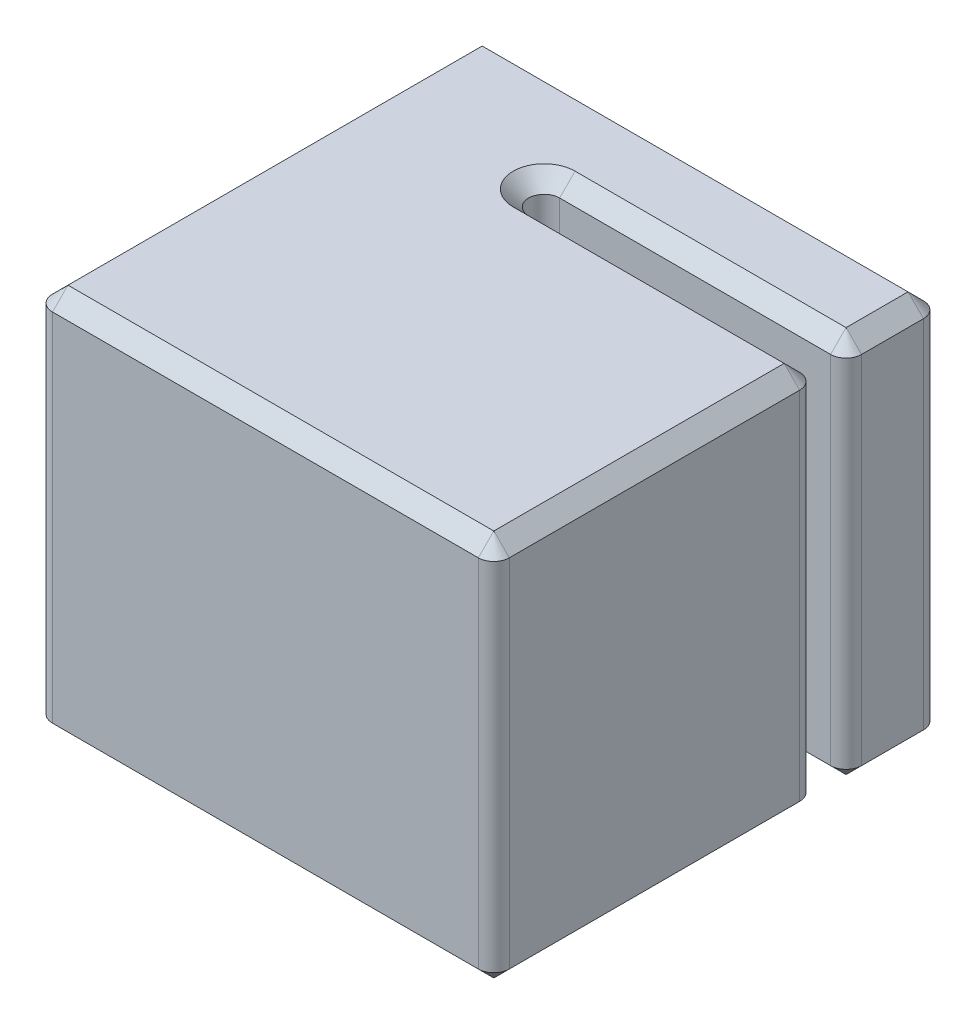
ISO-10303-21;
HEADER;
FILE_DESCRIPTION(('STEP AP214'),'2;1');
FILE_NAME('part.step','',(''),(''),'','','');
FILE_SCHEMA(('AUTOMOTIVE_DESIGN { 1 0 10303 214 1 1 1 1 }'));
ENDSEC;
DATA;
#1=APPLICATION_CONTEXT('core data for automotive mechanical design processes');
#2=APPLICATION_PROTOCOL_DEFINITION('international standard','automotive_design',2000,#1);
#3=PRODUCT_CONTEXT('',#1,'mechanical');
#4=PRODUCT('Part','Part','',(#3));
#5=PRODUCT_RELATED_PRODUCT_CATEGORY('part','',(#4));
#6=PRODUCT_DEFINITION_FORMATION('','',#4);
#7=PRODUCT_DEFINITION_CONTEXT('part definition',#1,'design');
#8=PRODUCT_DEFINITION('design','',#6,#7);
#9=PRODUCT_DEFINITION_SHAPE('','',#8);
#10=(LENGTH_UNIT() NAMED_UNIT(*) SI_UNIT(.MILLI.,.METRE.));
#11=(NAMED_UNIT(*) PLANE_ANGLE_UNIT() SI_UNIT($,.RADIAN.));
#12=(NAMED_UNIT(*) SI_UNIT($,.STERADIAN.) SOLID_ANGLE_UNIT());
#13=UNCERTAINTY_MEASURE_WITH_UNIT(LENGTH_MEASURE(1.E-05),#10,'distance_accuracy_value','');
#14=(GEOMETRIC_REPRESENTATION_CONTEXT(3) GLOBAL_UNCERTAINTY_ASSIGNED_CONTEXT((#13)) GLOBAL_UNIT_ASSIGNED_CONTEXT((#10,
#11,#12)) REPRESENTATION_CONTEXT('',''));
#15=CARTESIAN_POINT('',(0.,0.,0.));
#16=DIRECTION('',(0.,0.,1.));
#17=DIRECTION('',(1.,0.,0.));
#18=AXIS2_PLACEMENT_3D('',#15,#16,#17);
#19=CARTESIAN_POINT('',(0.,10.,0.));
#20=DIRECTION('',(0.,-1.,0.));
#21=DIRECTION('',(0.,0.,-1.));
#22=AXIS2_PLACEMENT_3D('',#19,#20,#21);
#23=CYLINDRICAL_SURFACE('',#22,0.4);
#24=DIRECTION('',(0.,-1.,0.));
#25=VECTOR('',#24,1.);
#26=CARTESIAN_POINT('',(0.,10.,0.4));
#27=LINE('',#26,#25);
#28=CARTESIAN_POINT('',(0.,9.6,0.4));
#29=VERTEX_POINT('',#28);
#30=CARTESIAN_POINT('',(0.,0.400000000000001,0.4));
#31=VERTEX_POINT('',#30);
#32=EDGE_CURVE('E347',#29,#31,#27,.T.);
#33=ORIENTED_EDGE('',*,*,#32,.T.);
#34=CARTESIAN_POINT('',(0.,0.400000000000001,0.));
#35=DIRECTION('',(0.,1.,0.));
#36=DIRECTION('',(0.,0.,1.));
#37=AXIS2_PLACEMENT_3D('',#34,#35,#36);
#38=CIRCLE('',#37,0.4);
#39=CARTESIAN_POINT('',(0.,0.400000000000001,-0.4));
#40=VERTEX_POINT('',#39);
#41=EDGE_CURVE('E293',#31,#40,#38,.F.);
#42=ORIENTED_EDGE('',*,*,#41,.T.);
#43=DIRECTION('',(0.,-1.,0.));
#44=VECTOR('',#43,1.);
#45=CARTESIAN_POINT('',(0.,10.,-0.4));
#46=LINE('',#45,#44);
#47=CARTESIAN_POINT('',(0.,9.6,-0.4));
#48=VERTEX_POINT('',#47);
#49=EDGE_CURVE('E209',#48,#40,#46,.T.);
#50=ORIENTED_EDGE('',*,*,#49,.F.);
#51=CARTESIAN_POINT('',(0.,9.6,0.));
#52=DIRECTION('',(0.,1.,0.));
#53=DIRECTION('',(0.,0.,1.));
#54=AXIS2_PLACEMENT_3D('',#51,#52,#53);
#55=CIRCLE('',#54,0.4);
#56=EDGE_CURVE('E291',#48,#29,#55,.T.);
#57=ORIENTED_EDGE('',*,*,#56,.T.);
#58=EDGE_LOOP('',(#33,#42,#50,#57));
#59=FACE_BOUND('',#58,.T.);
#60=ADVANCED_FACE('F36',(#59),#23,.F.);
#61=CARTESIAN_POINT('',(0.,10.,-0.4));
#62=DIRECTION('',(0.,0.,-1.));
#63=DIRECTION('',(-1.,0.,0.));
#64=AXIS2_PLACEMENT_3D('',#61,#62,#63);
#65=PLANE('',#64);
#66=ORIENTED_EDGE('',*,*,#49,.T.);
#67=DIRECTION('',(1.,0.,0.));
#68=VECTOR('',#67,1.);
#69=CARTESIAN_POINT('',(0.,0.400000000000001,-0.4));
#70=LINE('',#69,#68);
#71=CARTESIAN_POINT('',(7.,0.400000000000001,-0.4));
#72=VERTEX_POINT('',#71);
#73=EDGE_CURVE('E208',#40,#72,#70,.T.);
#74=ORIENTED_EDGE('',*,*,#73,.T.);
#75=DIRECTION('',(0.,-1.,0.));
#76=VECTOR('',#75,1.);
#77=CARTESIAN_POINT('',(7.,10.,-0.4));
#78=LINE('',#77,#76);
#79=CARTESIAN_POINT('',(7.,9.6,-0.4));
#80=VERTEX_POINT('',#79);
#81=EDGE_CURVE('E190',#80,#72,#78,.T.);
#82=ORIENTED_EDGE('',*,*,#81,.F.);
#83=DIRECTION('',(-1.,0.,0.));
#84=VECTOR('',#83,1.);
#85=CARTESIAN_POINT('',(0.,9.6,-0.4));
#86=LINE('',#85,#84);
#87=EDGE_CURVE('E205',#80,#48,#86,.T.);
#88=ORIENTED_EDGE('',*,*,#87,.T.);
#89=EDGE_LOOP('',(#66,#74,#82,#88));
#90=FACE_BOUND('',#89,.T.);
#91=ADVANCED_FACE('F203',(#90),#65,.F.);
#92=CARTESIAN_POINT('',(7.,10.,-0.8));
#93=DIRECTION('',(0.,-1.,0.));
#94=DIRECTION('',(0.,0.,-1.));
#95=AXIS2_PLACEMENT_3D('',#92,#93,#94);
#96=CYLINDRICAL_SURFACE('',#95,0.400000000000001);
#97=ORIENTED_EDGE('',*,*,#81,.T.);
#98=CARTESIAN_POINT('',(7.,0.400000000000001,-0.8));
#99=DIRECTION('',(0.,1.,0.));
#100=DIRECTION('',(0.,0.,1.));
#101=AXIS2_PLACEMENT_3D('',#98,#99,#100);
#102=CIRCLE('',#101,0.400000000000001);
#103=CARTESIAN_POINT('',(7.4,0.400000000000001,-0.8));
#104=VERTEX_POINT('',#103);
#105=EDGE_CURVE('E197',#72,#104,#102,.T.);
#106=ORIENTED_EDGE('',*,*,#105,.T.);
#107=DIRECTION('',(0.,-1.,0.));
#108=VECTOR('',#107,1.);
#109=CARTESIAN_POINT('',(7.4,10.,-0.8));
#110=LINE('',#109,#108);
#111=CARTESIAN_POINT('',(7.4,9.6,-0.8));
#112=VERTEX_POINT('',#111);
#113=EDGE_CURVE('E192',#112,#104,#110,.T.);
#114=ORIENTED_EDGE('',*,*,#113,.F.);
#115=CARTESIAN_POINT('',(7.,9.6,-0.8));
#116=DIRECTION('',(0.,1.,0.));
#117=DIRECTION('',(0.,0.,1.));
#118=AXIS2_PLACEMENT_3D('',#115,#116,#117);
#119=CIRCLE('',#118,0.400000000000001);
#120=EDGE_CURVE('E187',#112,#80,#119,.F.);
#121=ORIENTED_EDGE('',*,*,#120,.T.);
#122=EDGE_LOOP('',(#97,#106,#114,#121));
#123=FACE_BOUND('',#122,.T.);
#124=ADVANCED_FACE('F189',(#123),#96,.T.);
#125=CARTESIAN_POINT('',(7.4,10.,-0.8));
#126=DIRECTION('',(-1.,0.,0.));
#127=DIRECTION('',(0.,0.,1.));
#128=AXIS2_PLACEMENT_3D('',#125,#126,#127);
#129=PLANE('',#128);
#130=ORIENTED_EDGE('',*,*,#113,.T.);
#131=DIRECTION('',(0.,0.,-1.));
#132=VECTOR('',#131,1.);
#133=CARTESIAN_POINT('',(7.4,0.400000000000001,-0.8));
#134=LINE('',#133,#132);
#135=CARTESIAN_POINT('',(7.4,0.400000000000001,-2.4));
#136=VERTEX_POINT('',#135);
#137=EDGE_CURVE('E248',#104,#136,#134,.T.);
#138=ORIENTED_EDGE('',*,*,#137,.T.);
#139=DIRECTION('',(0.,-1.,0.));
#140=VECTOR('',#139,1.);
#141=CARTESIAN_POINT('',(7.4,10.,-2.4));
#142=LINE('',#141,#140);
#143=CARTESIAN_POINT('',(7.4,9.6,-2.4));
#144=VERTEX_POINT('',#143);
#145=EDGE_CURVE('E403',#144,#136,#142,.T.);
#146=ORIENTED_EDGE('',*,*,#145,.F.);
#147=DIRECTION('',(0.,0.,1.));
#148=VECTOR('',#147,1.);
#149=CARTESIAN_POINT('',(7.4,9.6,-0.8));
#150=LINE('',#149,#148);
#151=EDGE_CURVE('E246',#144,#112,#150,.T.);
#152=ORIENTED_EDGE('',*,*,#151,.T.);
#153=EDGE_LOOP('',(#130,#138,#146,#152));
#154=FACE_BOUND('',#153,.T.);
#155=ADVANCED_FACE('F413',(#154),#129,.F.);
#156=CARTESIAN_POINT('',(7.,10.,-2.4));
#157=DIRECTION('',(0.,-1.,0.));
#158=DIRECTION('',(0.,0.,-1.));
#159=AXIS2_PLACEMENT_3D('',#156,#157,#158);
#160=CYLINDRICAL_SURFACE('',#159,0.4);
#161=ORIENTED_EDGE('',*,*,#145,.T.);
#162=CARTESIAN_POINT('',(7.,0.400000000000001,-2.4));
#163=DIRECTION('',(0.,1.,0.));
#164=DIRECTION('',(0.,0.,1.));
#165=AXIS2_PLACEMENT_3D('',#162,#163,#164);
#166=CIRCLE('',#165,0.4);
#167=CARTESIAN_POINT('',(7.,0.400000000000001,-2.8));
#168=VERTEX_POINT('',#167);
#169=EDGE_CURVE('E252',#136,#168,#166,.T.);
#170=ORIENTED_EDGE('',*,*,#169,.T.);
#171=DIRECTION('',(0.,-1.,0.));
#172=VECTOR('',#171,1.);
#173=CARTESIAN_POINT('',(7.,10.,-2.8));
#174=LINE('',#173,#172);
#175=CARTESIAN_POINT('',(7.,9.6,-2.8));
#176=VERTEX_POINT('',#175);
#177=EDGE_CURVE('E401',#176,#168,#174,.T.);
#178=ORIENTED_EDGE('',*,*,#177,.F.);
#179=CARTESIAN_POINT('',(7.,9.6,-2.4));
#180=DIRECTION('',(0.,1.,0.));
#181=DIRECTION('',(0.,0.,1.));
#182=AXIS2_PLACEMENT_3D('',#179,#180,#181);
#183=CIRCLE('',#182,0.4);
#184=EDGE_CURVE('E250',#176,#144,#183,.F.);
#185=ORIENTED_EDGE('',*,*,#184,.T.);
#186=EDGE_LOOP('',(#161,#170,#178,#185));
#187=FACE_BOUND('',#186,.T.);
#188=ADVANCED_FACE('F443',(#187),#160,.T.);
#189=CARTESIAN_POINT('',(7.,10.,-2.8));
#190=DIRECTION('',(0.,0.,1.));
#191=DIRECTION('',(1.,0.,0.));
#192=AXIS2_PLACEMENT_3D('',#189,#190,#191);
#193=PLANE('',#192);
#194=ORIENTED_EDGE('',*,*,#177,.T.);
#195=DIRECTION('',(-1.,0.,0.));
#196=VECTOR('',#195,1.);
#197=CARTESIAN_POINT('',(7.,0.400000000000001,-2.8));
#198=LINE('',#197,#196);
#199=CARTESIAN_POINT('',(-4.,0.400000000000001,-2.8));
#200=VERTEX_POINT('',#199);
#201=EDGE_CURVE('E256',#168,#200,#198,.T.);
#202=ORIENTED_EDGE('',*,*,#201,.T.);
#203=DIRECTION('',(0.,-1.,0.));
#204=VECTOR('',#203,1.);
#205=CARTESIAN_POINT('',(-4.,10.,-2.8));
#206=LINE('',#205,#204);
#207=CARTESIAN_POINT('',(-4.,9.6,-2.8));
#208=VERTEX_POINT('',#207);
#209=EDGE_CURVE('E392',#208,#200,#206,.T.);
#210=ORIENTED_EDGE('',*,*,#209,.F.);
#211=DIRECTION('',(1.,0.,0.));
#212=VECTOR('',#211,1.);
#213=CARTESIAN_POINT('',(7.,9.6,-2.8));
#214=LINE('',#213,#212);
#215=EDGE_CURVE('E254',#208,#176,#214,.T.);
#216=ORIENTED_EDGE('',*,*,#215,.T.);
#217=EDGE_LOOP('',(#194,#202,#210,#216));
#218=FACE_BOUND('',#217,.T.);
#219=ADVANCED_FACE('F398',(#218),#193,.F.);
#220=CARTESIAN_POINT('',(-4.,10.,-2.4));
#221=DIRECTION('',(0.,-1.,0.));
#222=DIRECTION('',(0.,0.,-1.));
#223=AXIS2_PLACEMENT_3D('',#220,#221,#222);
#224=CYLINDRICAL_SURFACE('',#223,0.400000000000001);
#225=ORIENTED_EDGE('',*,*,#209,.T.);
#226=CARTESIAN_POINT('',(-4.,0.400000000000001,-2.4));
#227=DIRECTION('',(0.,1.,0.));
#228=DIRECTION('',(0.,0.,1.));
#229=AXIS2_PLACEMENT_3D('',#226,#227,#228);
#230=CIRCLE('',#229,0.400000000000001);
#231=CARTESIAN_POINT('',(-4.4,0.400000000000001,-2.4));
#232=VERTEX_POINT('',#231);
#233=EDGE_CURVE('E260',#200,#232,#230,.T.);
#234=ORIENTED_EDGE('',*,*,#233,.T.);
#235=DIRECTION('',(0.,-1.,0.));
#236=VECTOR('',#235,1.);
#237=CARTESIAN_POINT('',(-4.4,10.,-2.4));
#238=LINE('',#237,#236);
#239=CARTESIAN_POINT('',(-4.4,9.6,-2.4));
#240=VERTEX_POINT('',#239);
#241=EDGE_CURVE('E395',#240,#232,#238,.T.);
#242=ORIENTED_EDGE('',*,*,#241,.F.);
#243=CARTESIAN_POINT('',(-4.,9.6,-2.4));
#244=DIRECTION('',(0.,1.,0.));
#245=DIRECTION('',(0.,0.,1.));
#246=AXIS2_PLACEMENT_3D('',#243,#244,#245);
#247=CIRCLE('',#246,0.400000000000001);
#248=EDGE_CURVE('E258',#240,#208,#247,.F.);
#249=ORIENTED_EDGE('',*,*,#248,.T.);
#250=EDGE_LOOP('',(#225,#234,#242,#249));
#251=FACE_BOUND('',#250,.T.);
#252=ADVANCED_FACE('F391',(#251),#224,.T.);
#253=CARTESIAN_POINT('',(-4.4,10.,-2.4));
#254=DIRECTION('',(1.,0.,0.));
#255=DIRECTION('',(0.,0.,-1.));
#256=AXIS2_PLACEMENT_3D('',#253,#254,#255);
#257=PLANE('',#256);
#258=ORIENTED_EDGE('',*,*,#241,.T.);
#259=DIRECTION('',(0.,0.,1.));
#260=VECTOR('',#259,1.);
#261=CARTESIAN_POINT('',(-4.4,0.400000000000001,-2.4));
#262=LINE('',#261,#260);
#263=CARTESIAN_POINT('',(-4.4,0.400000000000001,8.3));
#264=VERTEX_POINT('',#263);
#265=EDGE_CURVE('E264',#232,#264,#262,.T.);
#266=ORIENTED_EDGE('',*,*,#265,.T.);
#267=DIRECTION('',(0.,-1.,0.));
#268=VECTOR('',#267,1.);
#269=CARTESIAN_POINT('',(-4.4,10.,8.3));
#270=LINE('',#269,#268);
#271=CARTESIAN_POINT('',(-4.4,9.6,8.3));
#272=VERTEX_POINT('',#271);
#273=EDGE_CURVE('E405',#272,#264,#270,.T.);
#274=ORIENTED_EDGE('',*,*,#273,.F.);
#275=DIRECTION('',(0.,0.,-1.));
#276=VECTOR('',#275,1.);
#277=CARTESIAN_POINT('',(-4.4,9.6,-2.4));
#278=LINE('',#277,#276);
#279=EDGE_CURVE('E262',#272,#240,#278,.T.);
#280=ORIENTED_EDGE('',*,*,#279,.T.);
#281=EDGE_LOOP('',(#258,#266,#274,#280));
#282=FACE_BOUND('',#281,.T.);
#283=ADVANCED_FACE('F850',(#282),#257,.F.);
#284=CARTESIAN_POINT('',(-4.,10.,8.3));
#285=DIRECTION('',(0.,-1.,0.));
#286=DIRECTION('',(0.,0.,-1.));
#287=AXIS2_PLACEMENT_3D('',#284,#285,#286);
#288=CYLINDRICAL_SURFACE('',#287,0.399999999999999);
#289=ORIENTED_EDGE('',*,*,#273,.T.);
#290=CARTESIAN_POINT('',(-4.,0.400000000000001,8.3));
#291=DIRECTION('',(0.,1.,0.));
#292=DIRECTION('',(0.,0.,1.));
#293=AXIS2_PLACEMENT_3D('',#290,#291,#292);
#294=CIRCLE('',#293,0.399999999999999);
#295=CARTESIAN_POINT('',(-4.,0.400000000000001,8.7));
#296=VERTEX_POINT('',#295);
#297=EDGE_CURVE('E268',#264,#296,#294,.T.);
#298=ORIENTED_EDGE('',*,*,#297,.T.);
#299=DIRECTION('',(0.,-1.,0.));
#300=VECTOR('',#299,1.);
#301=CARTESIAN_POINT('',(-4.,10.,8.7));
#302=LINE('',#301,#300);
#303=CARTESIAN_POINT('',(-4.,9.6,8.7));
#304=VERTEX_POINT('',#303);
#305=EDGE_CURVE('E945',#304,#296,#302,.T.);
#306=ORIENTED_EDGE('',*,*,#305,.F.);
#307=CARTESIAN_POINT('',(-4.,9.6,8.3));
#308=DIRECTION('',(0.,1.,0.));
#309=DIRECTION('',(0.,0.,1.));
#310=AXIS2_PLACEMENT_3D('',#307,#308,#309);
#311=CIRCLE('',#310,0.399999999999999);
#312=EDGE_CURVE('E266',#304,#272,#311,.F.);
#313=ORIENTED_EDGE('',*,*,#312,.T.);
#314=EDGE_LOOP('',(#289,#298,#306,#313));
#315=FACE_BOUND('',#314,.T.);
#316=ADVANCED_FACE('F841',(#315),#288,.T.);
#317=CARTESIAN_POINT('',(-4.,10.,8.7));
#318=DIRECTION('',(0.,0.,-1.));
#319=DIRECTION('',(-1.,0.,0.));
#320=AXIS2_PLACEMENT_3D('',#317,#318,#319);
#321=PLANE('',#320);
#322=ORIENTED_EDGE('',*,*,#305,.T.);
#323=DIRECTION('',(1.,0.,0.));
#324=VECTOR('',#323,1.);
#325=CARTESIAN_POINT('',(-4.,0.400000000000001,8.7));
#326=LINE('',#325,#324);
#327=CARTESIAN_POINT('',(7.,0.400000000000001,8.7));
#328=VERTEX_POINT('',#327);
#329=EDGE_CURVE('E272',#296,#328,#326,.T.);
#330=ORIENTED_EDGE('',*,*,#329,.T.);
#331=DIRECTION('',(0.,-1.,0.));
#332=VECTOR('',#331,1.);
#333=CARTESIAN_POINT('',(7.,10.,8.7));
#334=LINE('',#333,#332);
#335=CARTESIAN_POINT('',(7.,9.6,8.7));
#336=VERTEX_POINT('',#335);
#337=EDGE_CURVE('E950',#336,#328,#334,.T.);
#338=ORIENTED_EDGE('',*,*,#337,.F.);
#339=DIRECTION('',(-1.,0.,0.));
#340=VECTOR('',#339,1.);
#341=CARTESIAN_POINT('',(-4.,9.6,8.7));
#342=LINE('',#341,#340);
#343=EDGE_CURVE('E270',#336,#304,#342,.T.);
#344=ORIENTED_EDGE('',*,*,#343,.T.);
#345=EDGE_LOOP('',(#322,#330,#338,#344));
#346=FACE_BOUND('',#345,.T.);
#347=ADVANCED_FACE('F832',(#346),#321,.F.);
#348=CARTESIAN_POINT('',(7.,10.,8.3));
#349=DIRECTION('',(0.,-1.,0.));
#350=DIRECTION('',(0.,0.,-1.));
#351=AXIS2_PLACEMENT_3D('',#348,#349,#350);
#352=CYLINDRICAL_SURFACE('',#351,0.399999999999998);
#353=ORIENTED_EDGE('',*,*,#337,.T.);
#354=CARTESIAN_POINT('',(7.,0.400000000000001,8.3));
#355=DIRECTION('',(0.,1.,0.));
#356=DIRECTION('',(0.,0.,1.));
#357=AXIS2_PLACEMENT_3D('',#354,#355,#356);
#358=CIRCLE('',#357,0.399999999999998);
#359=CARTESIAN_POINT('',(7.4,0.400000000000001,8.3));
#360=VERTEX_POINT('',#359);
#361=EDGE_CURVE('E276',#328,#360,#358,.T.);
#362=ORIENTED_EDGE('',*,*,#361,.T.);
#363=DIRECTION('',(0.,-1.,0.));
#364=VECTOR('',#363,1.);
#365=CARTESIAN_POINT('',(7.4,10.,8.3));
#366=LINE('',#365,#364);
#367=CARTESIAN_POINT('',(7.4,9.6,8.3));
#368=VERTEX_POINT('',#367);
#369=EDGE_CURVE('E952',#368,#360,#366,.T.);
#370=ORIENTED_EDGE('',*,*,#369,.F.);
#371=CARTESIAN_POINT('',(7.,9.6,8.3));
#372=DIRECTION('',(0.,1.,0.));
#373=DIRECTION('',(0.,0.,1.));
#374=AXIS2_PLACEMENT_3D('',#371,#372,#373);
#375=CIRCLE('',#374,0.399999999999998);
#376=EDGE_CURVE('E274',#368,#336,#375,.F.);
#377=ORIENTED_EDGE('',*,*,#376,.T.);
#378=EDGE_LOOP('',(#353,#362,#370,#377));
#379=FACE_BOUND('',#378,.T.);
#380=ADVANCED_FACE('F823',(#379),#352,.T.);
#381=CARTESIAN_POINT('',(7.4,10.,8.3));
#382=DIRECTION('',(-1.,0.,0.));
#383=DIRECTION('',(0.,0.,1.));
#384=AXIS2_PLACEMENT_3D('',#381,#382,#383);
#385=PLANE('',#384);
#386=ORIENTED_EDGE('',*,*,#369,.T.);
#387=DIRECTION('',(0.,0.,-1.));
#388=VECTOR('',#387,1.);
#389=CARTESIAN_POINT('',(7.4,0.400000000000001,8.3));
#390=LINE('',#389,#388);
#391=CARTESIAN_POINT('',(7.4,0.400000000000001,0.8));
#392=VERTEX_POINT('',#391);
#393=EDGE_CURVE('E280',#360,#392,#390,.T.);
#394=ORIENTED_EDGE('',*,*,#393,.T.);
#395=DIRECTION('',(0.,-1.,0.));
#396=VECTOR('',#395,1.);
#397=CARTESIAN_POINT('',(7.4,10.,0.8));
#398=LINE('',#397,#396);
#399=CARTESIAN_POINT('',(7.4,9.6,0.8));
#400=VERTEX_POINT('',#399);
#401=EDGE_CURVE('E957',#400,#392,#398,.T.);
#402=ORIENTED_EDGE('',*,*,#401,.F.);
#403=DIRECTION('',(0.,0.,1.));
#404=VECTOR('',#403,1.);
#405=CARTESIAN_POINT('',(7.4,9.6,8.3));
#406=LINE('',#405,#404);
#407=EDGE_CURVE('E278',#400,#368,#406,.T.);
#408=ORIENTED_EDGE('',*,*,#407,.T.);
#409=EDGE_LOOP('',(#386,#394,#402,#408));
#410=FACE_BOUND('',#409,.T.);
#411=ADVANCED_FACE('F814',(#410),#385,.F.);
#412=CARTESIAN_POINT('',(7.,10.,0.8));
#413=DIRECTION('',(0.,-1.,0.));
#414=DIRECTION('',(0.,0.,-1.));
#415=AXIS2_PLACEMENT_3D('',#412,#413,#414);
#416=CYLINDRICAL_SURFACE('',#415,0.400000000000001);
#417=ORIENTED_EDGE('',*,*,#401,.T.);
#418=CARTESIAN_POINT('',(7.,0.400000000000001,0.8));
#419=DIRECTION('',(0.,1.,0.));
#420=DIRECTION('',(0.,0.,1.));
#421=AXIS2_PLACEMENT_3D('',#418,#419,#420);
#422=CIRCLE('',#421,0.400000000000001);
#423=CARTESIAN_POINT('',(7.,0.400000000000001,0.4));
#424=VERTEX_POINT('',#423);
#425=EDGE_CURVE('E284',#392,#424,#422,.T.);
#426=ORIENTED_EDGE('',*,*,#425,.T.);
#427=DIRECTION('',(0.,-1.,0.));
#428=VECTOR('',#427,1.);
#429=CARTESIAN_POINT('',(7.,10.,0.4));
#430=LINE('',#429,#428);
#431=CARTESIAN_POINT('',(7.,9.6,0.4));
#432=VERTEX_POINT('',#431);
#433=EDGE_CURVE('E960',#432,#424,#430,.T.);
#434=ORIENTED_EDGE('',*,*,#433,.F.);
#435=CARTESIAN_POINT('',(7.,9.6,0.8));
#436=DIRECTION('',(0.,1.,0.));
#437=DIRECTION('',(0.,0.,1.));
#438=AXIS2_PLACEMENT_3D('',#435,#436,#437);
#439=CIRCLE('',#438,0.400000000000001);
#440=EDGE_CURVE('E282',#432,#400,#439,.F.);
#441=ORIENTED_EDGE('',*,*,#440,.T.);
#442=EDGE_LOOP('',(#417,#426,#434,#441));
#443=FACE_BOUND('',#442,.T.);
#444=ADVANCED_FACE('F805',(#443),#416,.T.);
#445=CARTESIAN_POINT('',(0.,10.,0.4));
#446=DIRECTION('',(0.,0.,1.));
#447=DIRECTION('',(1.,0.,0.));
#448=AXIS2_PLACEMENT_3D('',#445,#446,#447);
#449=PLANE('',#448);
#450=ORIENTED_EDGE('',*,*,#433,.T.);
#451=DIRECTION('',(-1.,0.,0.));
#452=VECTOR('',#451,1.);
#453=CARTESIAN_POINT('',(0.,0.400000000000001,0.4));
#454=LINE('',#453,#452);
#455=EDGE_CURVE('E289',#424,#31,#454,.T.);
#456=ORIENTED_EDGE('',*,*,#455,.T.);
#457=ORIENTED_EDGE('',*,*,#32,.F.);
#458=DIRECTION('',(1.,0.,0.));
#459=VECTOR('',#458,1.);
#460=CARTESIAN_POINT('',(7.,9.6,0.4));
#461=LINE('',#460,#459);
#462=EDGE_CURVE('E286',#29,#432,#461,.T.);
#463=ORIENTED_EDGE('',*,*,#462,.T.);
#464=EDGE_LOOP('',(#450,#456,#457,#463));
#465=FACE_BOUND('',#464,.T.);
#466=ADVANCED_FACE('F797',(#465),#449,.F.);
#467=CARTESIAN_POINT('',(0.,10.,0.));
#468=DIRECTION('',(0.,1.,0.));
#469=DIRECTION('',(0.,0.,1.));
#470=AXIS2_PLACEMENT_3D('',#467,#468,#469);
#471=PLANE('',#470);
#472=DIRECTION('',(0.,0.,-1.));
#473=VECTOR('',#472,1.);
#474=CARTESIAN_POINT('',(7.,10.,0.8));
#475=LINE('',#474,#473);
#476=CARTESIAN_POINT('',(7.,10.,8.3));
#477=VERTEX_POINT('',#476);
#478=CARTESIAN_POINT('',(7.,10.,0.8));
#479=VERTEX_POINT('',#478);
#480=EDGE_CURVE('E46',#477,#479,#475,.T.);
#481=ORIENTED_EDGE('',*,*,#480,.T.);
#482=DIRECTION('',(-1.,0.,0.));
#483=VECTOR('',#482,1.);
#484=CARTESIAN_POINT('',(0.,10.,0.799999999999997));
#485=LINE('',#484,#483);
#486=CARTESIAN_POINT('',(0.,10.,0.799999999999997));
#487=VERTEX_POINT('',#486);
#488=EDGE_CURVE('E11',#479,#487,#485,.T.);
#489=ORIENTED_EDGE('',*,*,#488,.T.);
#490=CARTESIAN_POINT('',(0.,10.,0.));
#491=DIRECTION('',(0.,1.,0.));
#492=DIRECTION('',(0.,0.,1.));
#493=AXIS2_PLACEMENT_3D('',#490,#491,#492);
#494=CIRCLE('',#493,0.799999999999997);
#495=CARTESIAN_POINT('',(0.,10.,-0.799999999999997));
#496=VERTEX_POINT('',#495);
#497=EDGE_CURVE('E295',#487,#496,#494,.F.);
#498=ORIENTED_EDGE('',*,*,#497,.T.);
#499=DIRECTION('',(1.,0.,0.));
#500=VECTOR('',#499,1.);
#501=CARTESIAN_POINT('',(7.,10.,-0.799999999999997));
#502=LINE('',#501,#500);
#503=CARTESIAN_POINT('',(7.,10.,-0.799999999999997));
#504=VERTEX_POINT('',#503);
#505=EDGE_CURVE('E297',#496,#504,#502,.T.);
#506=ORIENTED_EDGE('',*,*,#505,.T.);
#507=DIRECTION('',(0.,0.,-1.));
#508=VECTOR('',#507,1.);
#509=CARTESIAN_POINT('',(7.,10.,-2.4));
#510=LINE('',#509,#508);
#511=CARTESIAN_POINT('',(7.,10.,-2.4));
#512=VERTEX_POINT('',#511);
#513=EDGE_CURVE('E299',#504,#512,#510,.T.);
#514=ORIENTED_EDGE('',*,*,#513,.T.);
#515=DIRECTION('',(-1.,0.,0.));
#516=VECTOR('',#515,1.);
#517=CARTESIAN_POINT('',(-4.,10.,-2.4));
#518=LINE('',#517,#516);
#519=CARTESIAN_POINT('',(-4.,10.,-2.4));
#520=VERTEX_POINT('',#519);
#521=EDGE_CURVE('E301',#512,#520,#518,.T.);
#522=ORIENTED_EDGE('',*,*,#521,.T.);
#523=DIRECTION('',(0.,0.,1.));
#524=VECTOR('',#523,1.);
#525=CARTESIAN_POINT('',(-4.,10.,8.3));
#526=LINE('',#525,#524);
#527=CARTESIAN_POINT('',(-4.,10.,8.3));
#528=VERTEX_POINT('',#527);
#529=EDGE_CURVE('E303',#520,#528,#526,.T.);
#530=ORIENTED_EDGE('',*,*,#529,.T.);
#531=DIRECTION('',(1.,0.,0.));
#532=VECTOR('',#531,1.);
#533=CARTESIAN_POINT('',(7.,10.,8.3));
#534=LINE('',#533,#532);
#535=EDGE_CURVE('E57',#528,#477,#534,.T.);
#536=ORIENTED_EDGE('',*,*,#535,.T.);
#537=EDGE_LOOP('',(#481,#489,#498,#506,#514,#522,#530,#536));
#538=FACE_BOUND('',#537,.T.);
#539=ADVANCED_FACE('F452',(#538),#471,.T.);
#540=CARTESIAN_POINT('',(0.,0.,0.));
#541=DIRECTION('',(0.,1.,0.));
#542=DIRECTION('',(0.,0.,1.));
#543=AXIS2_PLACEMENT_3D('',#540,#541,#542);
#544=PLANE('',#543);
#545=DIRECTION('',(0.,0.,1.));
#546=VECTOR('',#545,1.);
#547=CARTESIAN_POINT('',(7.,0.,0.));
#548=LINE('',#547,#546);
#549=CARTESIAN_POINT('',(7.,0.,-2.4));
#550=VERTEX_POINT('',#549);
#551=CARTESIAN_POINT('',(7.,0.,-0.8));
#552=VERTEX_POINT('',#551);
#553=EDGE_CURVE('E241',#550,#552,#548,.T.);
#554=ORIENTED_EDGE('',*,*,#553,.T.);
#555=DIRECTION('',(-1.,0.,0.));
#556=VECTOR('',#555,1.);
#557=CARTESIAN_POINT('',(0.,0.,-0.800000000000002));
#558=LINE('',#557,#556);
#559=CARTESIAN_POINT('',(0.,0.,-0.800000000000002));
#560=VERTEX_POINT('',#559);
#561=EDGE_CURVE('E198',#552,#560,#558,.T.);
#562=ORIENTED_EDGE('',*,*,#561,.T.);
#563=CARTESIAN_POINT('',(0.,0.,0.));
#564=DIRECTION('',(0.,1.,0.));
#565=DIRECTION('',(0.,0.,1.));
#566=AXIS2_PLACEMENT_3D('',#563,#564,#565);
#567=CIRCLE('',#566,0.800000000000002);
#568=CARTESIAN_POINT('',(0.,0.,0.800000000000002));
#569=VERTEX_POINT('',#568);
#570=EDGE_CURVE('E226',#560,#569,#567,.T.);
#571=ORIENTED_EDGE('',*,*,#570,.T.);
#572=DIRECTION('',(1.,0.,0.));
#573=VECTOR('',#572,1.);
#574=CARTESIAN_POINT('',(0.,0.,0.800000000000002));
#575=LINE('',#574,#573);
#576=CARTESIAN_POINT('',(7.,0.,0.800000000000002));
#577=VERTEX_POINT('',#576);
#578=EDGE_CURVE('E231',#569,#577,#575,.T.);
#579=ORIENTED_EDGE('',*,*,#578,.T.);
#580=DIRECTION('',(0.,0.,1.));
#581=VECTOR('',#580,1.);
#582=CARTESIAN_POINT('',(7.,0.,0.));
#583=LINE('',#582,#581);
#584=CARTESIAN_POINT('',(7.,0.,8.3));
#585=VERTEX_POINT('',#584);
#586=EDGE_CURVE('E233',#577,#585,#583,.T.);
#587=ORIENTED_EDGE('',*,*,#586,.T.);
#588=DIRECTION('',(-1.,0.,0.));
#589=VECTOR('',#588,1.);
#590=CARTESIAN_POINT('',(0.,0.,8.3));
#591=LINE('',#590,#589);
#592=CARTESIAN_POINT('',(-4.,0.,8.3));
#593=VERTEX_POINT('',#592);
#594=EDGE_CURVE('E235',#585,#593,#591,.T.);
#595=ORIENTED_EDGE('',*,*,#594,.T.);
#596=DIRECTION('',(0.,0.,-1.));
#597=VECTOR('',#596,1.);
#598=CARTESIAN_POINT('',(-4.,0.,0.));
#599=LINE('',#598,#597);
#600=CARTESIAN_POINT('',(-4.,0.,-2.4));
#601=VERTEX_POINT('',#600);
#602=EDGE_CURVE('E237',#593,#601,#599,.T.);
#603=ORIENTED_EDGE('',*,*,#602,.T.);
#604=DIRECTION('',(1.,0.,0.));
#605=VECTOR('',#604,1.);
#606=CARTESIAN_POINT('',(0.,0.,-2.4));
#607=LINE('',#606,#605);
#608=EDGE_CURVE('E239',#601,#550,#607,.T.);
#609=ORIENTED_EDGE('',*,*,#608,.T.);
#610=EDGE_LOOP('',(#554,#562,#571,#579,#587,#595,#603,#609));
#611=FACE_BOUND('',#610,.T.);
#612=ADVANCED_FACE('F431',(#611),#544,.F.);
#613=CARTESIAN_POINT('',(-4.,0.400000000000001,8.3));
#614=DIRECTION('',(0.,1.,0.));
#615=DIRECTION('',(0.,0.,1.));
#616=AXIS2_PLACEMENT_3D('',#613,#614,#615);
#617=CONICAL_SURFACE('',#616,0.400000000000002,0.78539816339745);
#618=DIRECTION('',(-0.707106781186548,0.707106781186547,0.));
#619=VECTOR('',#618,1.);
#620=CARTESIAN_POINT('',(-4.,0.,8.3));
#621=LINE('',#620,#619);
#622=EDGE_CURVE('E341',#593,#264,#621,.T.);
#623=ORIENTED_EDGE('',*,*,#622,.F.);
#624=DIRECTION('',(0.,-0.707106781186546,-0.707106781186549));
#625=VECTOR('',#624,1.);
#626=CARTESIAN_POINT('',(-4.,0.400000000000001,8.7));
#627=LINE('',#626,#625);
#628=EDGE_CURVE('E344',#296,#593,#627,.T.);
#629=ORIENTED_EDGE('',*,*,#628,.F.);
#630=ORIENTED_EDGE('',*,*,#297,.F.);
#631=EDGE_LOOP('',(#623,#629,#630));
#632=FACE_BOUND('',#631,.T.);
#633=ADVANCED_FACE('F555',(#632),#617,.T.);
#634=CARTESIAN_POINT('',(-4.,0.400000000000001,8.7));
#635=DIRECTION('',(0.,0.707106781186548,-0.707106781186547));
#636=DIRECTION('',(1.,0.,0.));
#637=AXIS2_PLACEMENT_3D('',#634,#635,#636);
#638=PLANE('',#637);
#639=ORIENTED_EDGE('',*,*,#628,.T.);
#640=ORIENTED_EDGE('',*,*,#594,.F.);
#641=DIRECTION('',(0.,-0.707106781186546,-0.707106781186549));
#642=VECTOR('',#641,1.);
#643=CARTESIAN_POINT('',(7.,0.400000000000001,8.7));
#644=LINE('',#643,#642);
#645=EDGE_CURVE('E338',#328,#585,#644,.T.);
#646=ORIENTED_EDGE('',*,*,#645,.F.);
#647=ORIENTED_EDGE('',*,*,#329,.F.);
#648=EDGE_LOOP('',(#639,#640,#646,#647));
#649=FACE_BOUND('',#648,.T.);
#650=ADVANCED_FACE('F548',(#649),#638,.F.);
#651=CARTESIAN_POINT('',(-4.4,0.400000000000001,-2.4));
#652=DIRECTION('',(0.707106781186547,0.707106781186548,0.));
#653=DIRECTION('',(0.,0.,1.));
#654=AXIS2_PLACEMENT_3D('',#651,#652,#653);
#655=PLANE('',#654);
#656=ORIENTED_EDGE('',*,*,#622,.T.);
#657=ORIENTED_EDGE('',*,*,#265,.F.);
#658=DIRECTION('',(-0.707106781186548,0.707106781186547,0.));
#659=VECTOR('',#658,1.);
#660=CARTESIAN_POINT('',(-4.,0.,-2.4));
#661=LINE('',#660,#659);
#662=EDGE_CURVE('E335',#601,#232,#661,.T.);
#663=ORIENTED_EDGE('',*,*,#662,.F.);
#664=ORIENTED_EDGE('',*,*,#602,.F.);
#665=EDGE_LOOP('',(#656,#657,#663,#664));
#666=FACE_BOUND('',#665,.T.);
#667=ADVANCED_FACE('F541',(#666),#655,.F.);
#668=CARTESIAN_POINT('',(7.,0.400000000000001,8.3));
#669=DIRECTION('',(0.,1.,0.));
#670=DIRECTION('',(0.,0.,1.));
#671=AXIS2_PLACEMENT_3D('',#668,#669,#670);
#672=CONICAL_SURFACE('',#671,0.400000000000002,0.78539816339745);
#673=ORIENTED_EDGE('',*,*,#361,.F.);
#674=ORIENTED_EDGE('',*,*,#645,.T.);
#675=DIRECTION('',(-0.707106781186548,-0.707106781186547,0.));
#676=VECTOR('',#675,1.);
#677=CARTESIAN_POINT('',(7.4,0.400000000000001,8.3));
#678=LINE('',#677,#676);
#679=EDGE_CURVE('E332',#360,#585,#678,.T.);
#680=ORIENTED_EDGE('',*,*,#679,.F.);
#681=EDGE_LOOP('',(#673,#674,#680));
#682=FACE_BOUND('',#681,.T.);
#683=ADVANCED_FACE('F534',(#682),#672,.T.);
#684=CARTESIAN_POINT('',(-4.,0.400000000000001,-2.4));
#685=DIRECTION('',(0.,1.,0.));
#686=DIRECTION('',(0.,0.,1.));
#687=AXIS2_PLACEMENT_3D('',#684,#685,#686);
#688=CONICAL_SURFACE('',#687,0.400000000000002,0.78539816339745);
#689=ORIENTED_EDGE('',*,*,#662,.T.);
#690=ORIENTED_EDGE('',*,*,#233,.F.);
#691=DIRECTION('',(0.,0.707106781186546,-0.707106781186549));
#692=VECTOR('',#691,1.);
#693=CARTESIAN_POINT('',(-4.,0.,-2.4));
#694=LINE('',#693,#692);
#695=EDGE_CURVE('E329',#601,#200,#694,.T.);
#696=ORIENTED_EDGE('',*,*,#695,.F.);
#697=EDGE_LOOP('',(#689,#690,#696));
#698=FACE_BOUND('',#697,.T.);
#699=ADVANCED_FACE('F527',(#698),#688,.T.);
#700=CARTESIAN_POINT('',(7.4,0.400000000000001,8.3));
#701=DIRECTION('',(-0.707106781186547,0.707106781186548,0.));
#702=DIRECTION('',(0.,0.,-1.));
#703=AXIS2_PLACEMENT_3D('',#700,#701,#702);
#704=PLANE('',#703);
#705=ORIENTED_EDGE('',*,*,#679,.T.);
#706=ORIENTED_EDGE('',*,*,#586,.F.);
#707=DIRECTION('',(-0.707106781186548,-0.707106781186547,0.));
#708=VECTOR('',#707,1.);
#709=CARTESIAN_POINT('',(7.4,0.400000000000001,0.8));
#710=LINE('',#709,#708);
#711=EDGE_CURVE('E326',#392,#577,#710,.T.);
#712=ORIENTED_EDGE('',*,*,#711,.F.);
#713=ORIENTED_EDGE('',*,*,#393,.F.);
#714=EDGE_LOOP('',(#705,#706,#712,#713));
#715=FACE_BOUND('',#714,.T.);
#716=ADVANCED_FACE('F521',(#715),#704,.F.);
#717=CARTESIAN_POINT('',(7.,0.400000000000001,-2.8));
#718=DIRECTION('',(0.,0.707106781186548,0.707106781186547));
#719=DIRECTION('',(-1.,0.,0.));
#720=AXIS2_PLACEMENT_3D('',#717,#718,#719);
#721=PLANE('',#720);
#722=ORIENTED_EDGE('',*,*,#695,.T.);
#723=ORIENTED_EDGE('',*,*,#201,.F.);
#724=DIRECTION('',(0.,0.707106781186547,-0.707106781186548));
#725=VECTOR('',#724,1.);
#726=CARTESIAN_POINT('',(7.,0.,-2.4));
#727=LINE('',#726,#725);
#728=EDGE_CURVE('E323',#550,#168,#727,.T.);
#729=ORIENTED_EDGE('',*,*,#728,.F.);
#730=ORIENTED_EDGE('',*,*,#608,.F.);
#731=EDGE_LOOP('',(#722,#723,#729,#730));
#732=FACE_BOUND('',#731,.T.);
#733=ADVANCED_FACE('F438',(#732),#721,.F.);
#734=CARTESIAN_POINT('',(7.,0.400000000000001,0.8));
#735=DIRECTION('',(0.,1.,0.));
#736=DIRECTION('',(0.,0.,1.));
#737=AXIS2_PLACEMENT_3D('',#734,#735,#736);
#738=CONICAL_SURFACE('',#737,0.400000000000002,0.78539816339745);
#739=ORIENTED_EDGE('',*,*,#425,.F.);
#740=ORIENTED_EDGE('',*,*,#711,.T.);
#741=DIRECTION('',(0.,-0.707106781186547,0.707106781186548));
#742=VECTOR('',#741,1.);
#743=CARTESIAN_POINT('',(7.,0.400000000000001,0.4));
#744=LINE('',#743,#742);
#745=EDGE_CURVE('E320',#424,#577,#744,.T.);
#746=ORIENTED_EDGE('',*,*,#745,.F.);
#747=EDGE_LOOP('',(#739,#740,#746));
#748=FACE_BOUND('',#747,.T.);
#749=ADVANCED_FACE('F509',(#748),#738,.T.);
#750=CARTESIAN_POINT('',(7.,0.400000000000001,-2.4));
#751=DIRECTION('',(0.,1.,0.));
#752=DIRECTION('',(0.,0.,1.));
#753=AXIS2_PLACEMENT_3D('',#750,#751,#752);
#754=CONICAL_SURFACE('',#753,0.400000000000002,0.78539816339745);
#755=ORIENTED_EDGE('',*,*,#728,.T.);
#756=ORIENTED_EDGE('',*,*,#169,.F.);
#757=DIRECTION('',(0.707106781186548,0.707106781186547,0.));
#758=VECTOR('',#757,1.);
#759=CARTESIAN_POINT('',(7.,0.,-2.4));
#760=LINE('',#759,#758);
#761=EDGE_CURVE('E317',#550,#136,#760,.T.);
#762=ORIENTED_EDGE('',*,*,#761,.F.);
#763=EDGE_LOOP('',(#755,#756,#762));
#764=FACE_BOUND('',#763,.T.);
#765=ADVANCED_FACE('F441',(#764),#754,.T.);
#766=CARTESIAN_POINT('',(0.,0.400000000000001,0.4));
#767=DIRECTION('',(0.,0.707106781186548,0.707106781186547));
#768=DIRECTION('',(-1.,0.,0.));
#769=AXIS2_PLACEMENT_3D('',#766,#767,#768);
#770=PLANE('',#769);
#771=ORIENTED_EDGE('',*,*,#745,.T.);
#772=ORIENTED_EDGE('',*,*,#578,.F.);
#773=DIRECTION('',(0.,-0.707106781186547,0.707106781186548));
#774=VECTOR('',#773,1.);
#775=CARTESIAN_POINT('',(0.,0.400000000000001,0.4));
#776=LINE('',#775,#774);
#777=EDGE_CURVE('E314',#31,#569,#776,.T.);
#778=ORIENTED_EDGE('',*,*,#777,.F.);
#779=ORIENTED_EDGE('',*,*,#455,.F.);
#780=EDGE_LOOP('',(#771,#772,#778,#779));
#781=FACE_BOUND('',#780,.T.);
#782=ADVANCED_FACE('F497',(#781),#770,.F.);
#783=CARTESIAN_POINT('',(7.4,0.400000000000001,-0.8));
#784=DIRECTION('',(-0.707106781186546,0.707106781186549,0.));
#785=DIRECTION('',(0.,0.,-1.));
#786=AXIS2_PLACEMENT_3D('',#783,#784,#785);
#787=PLANE('',#786);
#788=ORIENTED_EDGE('',*,*,#761,.T.);
#789=ORIENTED_EDGE('',*,*,#137,.F.);
#790=DIRECTION('',(0.707106781186548,0.707106781186547,0.));
#791=VECTOR('',#790,1.);
#792=CARTESIAN_POINT('',(7.,0.,-0.8));
#793=LINE('',#792,#791);
#794=EDGE_CURVE('E311',#552,#104,#793,.T.);
#795=ORIENTED_EDGE('',*,*,#794,.F.);
#796=ORIENTED_EDGE('',*,*,#553,.F.);
#797=EDGE_LOOP('',(#788,#789,#795,#796));
#798=FACE_BOUND('',#797,.T.);
#799=ADVANCED_FACE('F418',(#798),#787,.F.);
#800=CARTESIAN_POINT('',(0.,0.400000000000001,0.));
#801=DIRECTION('',(0.,-1.,0.));
#802=DIRECTION('',(0.,0.,-1.));
#803=AXIS2_PLACEMENT_3D('',#800,#801,#802);
#804=CONICAL_SURFACE('',#803,0.4,0.78539816339745);
#805=ORIENTED_EDGE('',*,*,#777,.T.);
#806=ORIENTED_EDGE('',*,*,#570,.F.);
#807=DIRECTION('',(0.,-0.707106781186547,-0.707106781186549));
#808=VECTOR('',#807,1.);
#809=CARTESIAN_POINT('',(0.,0.400000000000001,-0.4));
#810=LINE('',#809,#808);
#811=EDGE_CURVE('E309',#40,#560,#810,.T.);
#812=ORIENTED_EDGE('',*,*,#811,.F.);
#813=ORIENTED_EDGE('',*,*,#41,.F.);
#814=EDGE_LOOP('',(#805,#806,#812,#813));
#815=FACE_BOUND('',#814,.T.);
#816=ADVANCED_FACE('F485',(#815),#804,.F.);
#817=CARTESIAN_POINT('',(7.,0.400000000000001,-0.8));
#818=DIRECTION('',(0.,1.,0.));
#819=DIRECTION('',(0.,0.,1.));
#820=AXIS2_PLACEMENT_3D('',#817,#818,#819);
#821=CONICAL_SURFACE('',#820,0.400000000000002,0.78539816339745);
#822=ORIENTED_EDGE('',*,*,#794,.T.);
#823=ORIENTED_EDGE('',*,*,#105,.F.);
#824=DIRECTION('',(0.,0.707106781186546,0.707106781186549));
#825=VECTOR('',#824,1.);
#826=CARTESIAN_POINT('',(7.,0.,-0.800000000000002));
#827=LINE('',#826,#825);
#828=EDGE_CURVE('E307',#552,#72,#827,.T.);
#829=ORIENTED_EDGE('',*,*,#828,.F.);
#830=EDGE_LOOP('',(#822,#823,#829));
#831=FACE_BOUND('',#830,.T.);
#832=ADVANCED_FACE('F425',(#831),#821,.T.);
#833=CARTESIAN_POINT('',(0.,0.400000000000001,-0.4));
#834=DIRECTION('',(0.,0.707106781186548,-0.707106781186547));
#835=DIRECTION('',(1.,0.,0.));
#836=AXIS2_PLACEMENT_3D('',#833,#834,#835);
#837=PLANE('',#836);
#838=ORIENTED_EDGE('',*,*,#811,.T.);
#839=ORIENTED_EDGE('',*,*,#561,.F.);
#840=ORIENTED_EDGE('',*,*,#828,.T.);
#841=ORIENTED_EDGE('',*,*,#73,.F.);
#842=EDGE_LOOP('',(#838,#839,#840,#841));
#843=FACE_BOUND('',#842,.T.);
#844=ADVANCED_FACE('F427',(#843),#837,.F.);
#845=CARTESIAN_POINT('',(-4.,9.6,-2.4));
#846=DIRECTION('',(0.,-1.,0.));
#847=DIRECTION('',(0.,0.,-1.));
#848=AXIS2_PLACEMENT_3D('',#845,#846,#847);
#849=CONICAL_SURFACE('',#848,0.399999999999997,0.785398163397445);
#850=DIRECTION('',(0.,0.707106781186549,0.707106781186546));
#851=VECTOR('',#850,1.);
#852=CARTESIAN_POINT('',(-4.,9.6,-2.8));
#853=LINE('',#852,#851);
#854=EDGE_CURVE('E372',#208,#520,#853,.T.);
#855=ORIENTED_EDGE('',*,*,#854,.F.);
#856=ORIENTED_EDGE('',*,*,#248,.F.);
#857=DIRECTION('',(-0.707106781186545,-0.707106781186551,0.));
#858=VECTOR('',#857,1.);
#859=CARTESIAN_POINT('',(-4.,10.,-2.4));
#860=LINE('',#859,#858);
#861=EDGE_CURVE('E41',#520,#240,#860,.T.);
#862=ORIENTED_EDGE('',*,*,#861,.F.);
#863=EDGE_LOOP('',(#855,#856,#862));
#864=FACE_BOUND('',#863,.T.);
#865=ADVANCED_FACE('F39',(#864),#849,.T.);
#866=CARTESIAN_POINT('',(-4.,10.,0.));
#867=DIRECTION('',(-0.70710678118655,0.707106781186545,0.));
#868=DIRECTION('',(0.,0.,-1.));
#869=AXIS2_PLACEMENT_3D('',#866,#867,#868);
#870=PLANE('',#869);
#871=ORIENTED_EDGE('',*,*,#861,.T.);
#872=ORIENTED_EDGE('',*,*,#279,.F.);
#873=DIRECTION('',(-0.707106781186545,-0.70710678118655,0.));
#874=VECTOR('',#873,1.);
#875=CARTESIAN_POINT('',(-4.,10.,8.3));
#876=LINE('',#875,#874);
#877=EDGE_CURVE('E370',#528,#272,#876,.T.);
#878=ORIENTED_EDGE('',*,*,#877,.F.);
#879=ORIENTED_EDGE('',*,*,#529,.F.);
#880=EDGE_LOOP('',(#871,#872,#878,#879));
#881=FACE_BOUND('',#880,.T.);
#882=ADVANCED_FACE('F383',(#881),#870,.T.);
#883=CARTESIAN_POINT('',(0.,10.,-2.4));
#884=DIRECTION('',(0.,0.707106781186545,-0.70710678118655));
#885=DIRECTION('',(1.,0.,0.));
#886=AXIS2_PLACEMENT_3D('',#883,#884,#885);
#887=PLANE('',#886);
#888=ORIENTED_EDGE('',*,*,#854,.T.);
#889=ORIENTED_EDGE('',*,*,#521,.F.);
#890=DIRECTION('',(0.,0.70710678118655,0.707106781186545));
#891=VECTOR('',#890,1.);
#892=CARTESIAN_POINT('',(7.,9.6,-2.8));
#893=LINE('',#892,#891);
#894=EDGE_CURVE('E367',#176,#512,#893,.T.);
#895=ORIENTED_EDGE('',*,*,#894,.F.);
#896=ORIENTED_EDGE('',*,*,#215,.F.);
#897=EDGE_LOOP('',(#888,#889,#895,#896));
#898=FACE_BOUND('',#897,.T.);
#899=ADVANCED_FACE('F453',(#898),#887,.T.);
#900=CARTESIAN_POINT('',(-4.,9.6,8.3));
#901=DIRECTION('',(0.,-1.,0.));
#902=DIRECTION('',(0.,0.,-1.));
#903=AXIS2_PLACEMENT_3D('',#900,#901,#902);
#904=CONICAL_SURFACE('',#903,0.399999999999997,0.785398163397445);
#905=ORIENTED_EDGE('',*,*,#877,.T.);
#906=ORIENTED_EDGE('',*,*,#312,.F.);
#907=DIRECTION('',(0.,-0.707106781186549,0.707106781186546));
#908=VECTOR('',#907,1.);
#909=CARTESIAN_POINT('',(-4.,10.,8.3));
#910=LINE('',#909,#908);
#911=EDGE_CURVE('E364',#528,#304,#910,.T.);
#912=ORIENTED_EDGE('',*,*,#911,.F.);
#913=EDGE_LOOP('',(#905,#906,#912));
#914=FACE_BOUND('',#913,.T.);
#915=ADVANCED_FACE('F455',(#914),#904,.T.);
#916=CARTESIAN_POINT('',(7.,9.6,-2.4));
#917=DIRECTION('',(0.,-1.,0.));
#918=DIRECTION('',(0.,0.,-1.));
#919=AXIS2_PLACEMENT_3D('',#916,#917,#918);
#920=CONICAL_SURFACE('',#919,0.399999999999997,0.785398163397445);
#921=ORIENTED_EDGE('',*,*,#184,.F.);
#922=ORIENTED_EDGE('',*,*,#894,.T.);
#923=DIRECTION('',(-0.707106781186545,0.70710678118655,0.));
#924=VECTOR('',#923,1.);
#925=CARTESIAN_POINT('',(7.4,9.6,-2.4));
#926=LINE('',#925,#924);
#927=EDGE_CURVE('E361',#144,#512,#926,.T.);
#928=ORIENTED_EDGE('',*,*,#927,.F.);
#929=EDGE_LOOP('',(#921,#922,#928));
#930=FACE_BOUND('',#929,.T.);
#931=ADVANCED_FACE('F448',(#930),#920,.T.);
#932=CARTESIAN_POINT('',(0.,10.,8.3));
#933=DIRECTION('',(0.,0.707106781186545,0.70710678118655));
#934=DIRECTION('',(-1.,0.,0.));
#935=AXIS2_PLACEMENT_3D('',#932,#933,#934);
#936=PLANE('',#935);
#937=ORIENTED_EDGE('',*,*,#911,.T.);
#938=ORIENTED_EDGE('',*,*,#343,.F.);
#939=DIRECTION('',(0.,-0.707106781186549,0.707106781186546));
#940=VECTOR('',#939,1.);
#941=CARTESIAN_POINT('',(7.,10.,8.3));
#942=LINE('',#941,#940);
#943=EDGE_CURVE('E358',#477,#336,#942,.T.);
#944=ORIENTED_EDGE('',*,*,#943,.F.);
#945=ORIENTED_EDGE('',*,*,#535,.F.);
#946=EDGE_LOOP('',(#937,#938,#944,#945));
#947=FACE_BOUND('',#946,.T.);
#948=ADVANCED_FACE('F613',(#947),#936,.T.);
#949=CARTESIAN_POINT('',(7.,10.,0.));
#950=DIRECTION('',(0.707106781186549,0.707106781186546,0.));
#951=DIRECTION('',(0.,0.,1.));
#952=AXIS2_PLACEMENT_3D('',#949,#950,#951);
#953=PLANE('',#952);
#954=ORIENTED_EDGE('',*,*,#927,.T.);
#955=ORIENTED_EDGE('',*,*,#513,.F.);
#956=DIRECTION('',(-0.707106781186545,0.70710678118655,0.));
#957=VECTOR('',#956,1.);
#958=CARTESIAN_POINT('',(7.4,9.6,-0.8));
#959=LINE('',#958,#957);
#960=EDGE_CURVE('E214',#112,#504,#959,.T.);
#961=ORIENTED_EDGE('',*,*,#960,.F.);
#962=ORIENTED_EDGE('',*,*,#151,.F.);
#963=EDGE_LOOP('',(#954,#955,#961,#962));
#964=FACE_BOUND('',#963,.T.);
#965=ADVANCED_FACE('F451',(#964),#953,.T.);
#966=CARTESIAN_POINT('',(7.,9.6,8.3));
#967=DIRECTION('',(0.,-1.,0.));
#968=DIRECTION('',(0.,0.,-1.));
#969=AXIS2_PLACEMENT_3D('',#966,#967,#968);
#970=CONICAL_SURFACE('',#969,0.399999999999997,0.785398163397445);
#971=ORIENTED_EDGE('',*,*,#943,.T.);
#972=ORIENTED_EDGE('',*,*,#376,.F.);
#973=DIRECTION('',(0.707106781186545,-0.707106781186551,0.));
#974=VECTOR('',#973,1.);
#975=CARTESIAN_POINT('',(7.,10.,8.3));
#976=LINE('',#975,#974);
#977=EDGE_CURVE('E217',#477,#368,#976,.T.);
#978=ORIENTED_EDGE('',*,*,#977,.F.);
#979=EDGE_LOOP('',(#971,#972,#978));
#980=FACE_BOUND('',#979,.T.);
#981=ADVANCED_FACE('F601',(#980),#970,.T.);
#982=CARTESIAN_POINT('',(7.,9.6,-0.8));
#983=DIRECTION('',(0.,-1.,0.));
#984=DIRECTION('',(0.,0.,-1.));
#985=AXIS2_PLACEMENT_3D('',#982,#983,#984);
#986=CONICAL_SURFACE('',#985,0.399999999999997,0.785398163397445);
#987=ORIENTED_EDGE('',*,*,#120,.F.);
#988=ORIENTED_EDGE('',*,*,#960,.T.);
#989=DIRECTION('',(0.,0.707106781186549,-0.707106781186546));
#990=VECTOR('',#989,1.);
#991=CARTESIAN_POINT('',(7.,9.6,-0.4));
#992=LINE('',#991,#990);
#993=EDGE_CURVE('E212',#80,#504,#992,.T.);
#994=ORIENTED_EDGE('',*,*,#993,.F.);
#995=EDGE_LOOP('',(#987,#988,#994));
#996=FACE_BOUND('',#995,.T.);
#997=ADVANCED_FACE('F213',(#996),#986,.T.);
#998=CARTESIAN_POINT('',(7.,10.,0.));
#999=DIRECTION('',(0.70710678118655,0.707106781186545,0.));
#1000=DIRECTION('',(0.,0.,1.));
#1001=AXIS2_PLACEMENT_3D('',#998,#999,#1000);
#1002=PLANE('',#1001);
#1003=ORIENTED_EDGE('',*,*,#977,.T.);
#1004=ORIENTED_EDGE('',*,*,#407,.F.);
#1005=DIRECTION('',(0.707106781186545,-0.70710678118655,0.));
#1006=VECTOR('',#1005,1.);
#1007=CARTESIAN_POINT('',(7.,10.,0.8));
#1008=LINE('',#1007,#1006);
#1009=EDGE_CURVE('E218',#479,#400,#1008,.T.);
#1010=ORIENTED_EDGE('',*,*,#1009,.F.);
#1011=ORIENTED_EDGE('',*,*,#480,.F.);
#1012=EDGE_LOOP('',(#1003,#1004,#1010,#1011));
#1013=FACE_BOUND('',#1012,.T.);
#1014=ADVANCED_FACE('F589',(#1013),#1002,.T.);
#1015=CARTESIAN_POINT('',(0.,10.,-0.799999999999997));
#1016=DIRECTION('',(0.,0.707106781186545,0.70710678118655));
#1017=DIRECTION('',(-1.,0.,0.));
#1018=AXIS2_PLACEMENT_3D('',#1015,#1016,#1017);
#1019=PLANE('',#1018);
#1020=ORIENTED_EDGE('',*,*,#993,.T.);
#1021=ORIENTED_EDGE('',*,*,#505,.F.);
#1022=DIRECTION('',(0.,0.70710678118655,-0.707106781186545));
#1023=VECTOR('',#1022,1.);
#1024=CARTESIAN_POINT('',(0.,9.6,-0.4));
#1025=LINE('',#1024,#1023);
#1026=EDGE_CURVE('E223',#48,#496,#1025,.T.);
#1027=ORIENTED_EDGE('',*,*,#1026,.F.);
#1028=ORIENTED_EDGE('',*,*,#87,.F.);
#1029=EDGE_LOOP('',(#1020,#1021,#1027,#1028));
#1030=FACE_BOUND('',#1029,.T.);
#1031=ADVANCED_FACE('F221',(#1030),#1019,.T.);
#1032=CARTESIAN_POINT('',(7.,9.6,0.8));
#1033=DIRECTION('',(0.,-1.,0.));
#1034=DIRECTION('',(0.,0.,-1.));
#1035=AXIS2_PLACEMENT_3D('',#1032,#1033,#1034);
#1036=CONICAL_SURFACE('',#1035,0.399999999999997,0.785398163397445);
#1037=ORIENTED_EDGE('',*,*,#1009,.T.);
#1038=ORIENTED_EDGE('',*,*,#440,.F.);
#1039=DIRECTION('',(0.,-0.707106781186549,-0.707106781186546));
#1040=VECTOR('',#1039,1.);
#1041=CARTESIAN_POINT('',(7.,10.,0.799999999999997));
#1042=LINE('',#1041,#1040);
#1043=EDGE_CURVE('E350',#479,#432,#1042,.T.);
#1044=ORIENTED_EDGE('',*,*,#1043,.F.);
#1045=EDGE_LOOP('',(#1037,#1038,#1044));
#1046=FACE_BOUND('',#1045,.T.);
#1047=ADVANCED_FACE('F576',(#1046),#1036,.T.);
#1048=CARTESIAN_POINT('',(0.,10.,0.));
#1049=DIRECTION('',(0.,1.,0.));
#1050=DIRECTION('',(0.,0.,1.));
#1051=AXIS2_PLACEMENT_3D('',#1048,#1049,#1050);
#1052=CONICAL_SURFACE('',#1051,0.799999999999997,0.785398163397445);
#1053=ORIENTED_EDGE('',*,*,#1026,.T.);
#1054=ORIENTED_EDGE('',*,*,#497,.F.);
#1055=DIRECTION('',(0.,0.70710678118655,0.707106781186545));
#1056=VECTOR('',#1055,1.);
#1057=CARTESIAN_POINT('',(0.,9.6,0.4));
#1058=LINE('',#1057,#1056);
#1059=EDGE_CURVE('E348',#29,#487,#1058,.T.);
#1060=ORIENTED_EDGE('',*,*,#1059,.F.);
#1061=ORIENTED_EDGE('',*,*,#56,.F.);
#1062=EDGE_LOOP('',(#1053,#1054,#1060,#1061));
#1063=FACE_BOUND('',#1062,.T.);
#1064=ADVANCED_FACE('F569',(#1063),#1052,.F.);
#1065=CARTESIAN_POINT('',(0.,10.,0.799999999999997));
#1066=DIRECTION('',(0.,0.707106781186545,-0.70710678118655));
#1067=DIRECTION('',(1.,0.,0.));
#1068=AXIS2_PLACEMENT_3D('',#1065,#1066,#1067);
#1069=PLANE('',#1068);
#1070=ORIENTED_EDGE('',*,*,#1043,.T.);
#1071=ORIENTED_EDGE('',*,*,#462,.F.);
#1072=ORIENTED_EDGE('',*,*,#1059,.T.);
#1073=ORIENTED_EDGE('',*,*,#488,.F.);
#1074=EDGE_LOOP('',(#1070,#1071,#1072,#1073));
#1075=FACE_BOUND('',#1074,.T.);
#1076=ADVANCED_FACE('F563',(#1075),#1069,.T.);
#1077=CLOSED_SHELL('',(#60,#91,#124,#155,#188,#219,#252,#283,#316,#347,#380,#411,#444,#466,#539,
#612,#633,#650,#667,#683,#699,#716,#733,#749,#765,#782,#799,#816,#832,#844,#865,#882,#899,#915,
#931,#948,#965,#981,#997,#1014,#1031,#1047,#1064,#1076));
#1078=MANIFOLD_SOLID_BREP('B2',#1077);
#1079=ADVANCED_BREP_SHAPE_REPRESENTATION('',(#18,#1078),#14);
#1080=SHAPE_DEFINITION_REPRESENTATION(#9,#1079);
ENDSEC;
END-ISO-10303-21;
